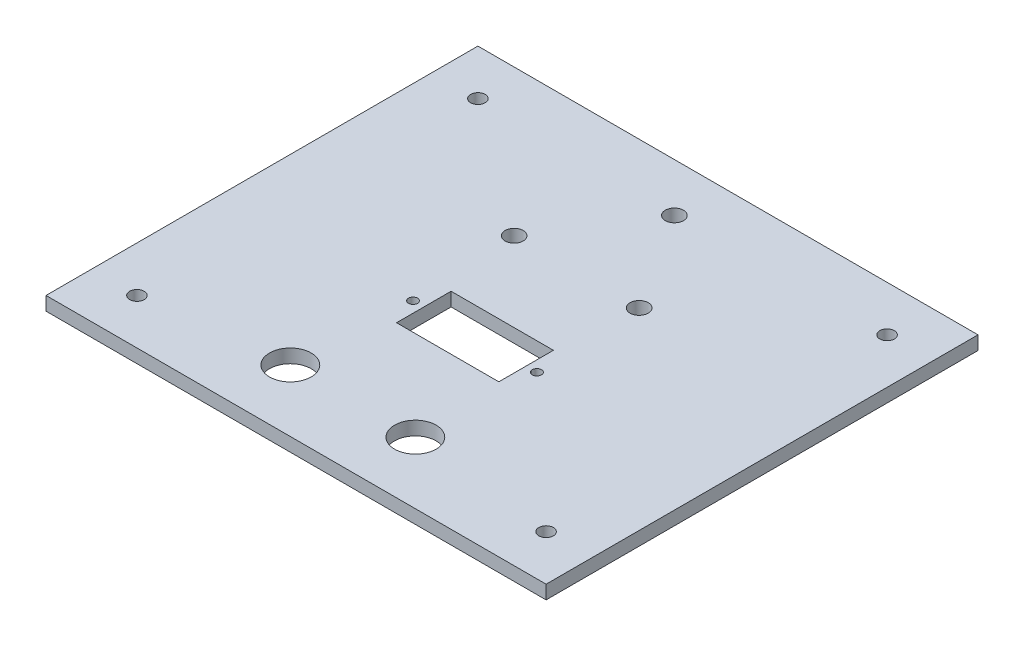
ISO-10303-21;
HEADER;
FILE_DESCRIPTION(('STEP AP214'),'2;1');
FILE_NAME('part.step','',(''),(''),'','','');
FILE_SCHEMA(('AUTOMOTIVE_DESIGN { 1 0 10303 214 1 1 1 1 }'));
ENDSEC;
DATA;
#1=APPLICATION_CONTEXT('core data for automotive mechanical design processes');
#2=APPLICATION_PROTOCOL_DEFINITION('international standard','automotive_design',2000,#1);
#3=PRODUCT_CONTEXT('',#1,'mechanical');
#4=PRODUCT('Part','Part','',(#3));
#5=PRODUCT_RELATED_PRODUCT_CATEGORY('part','',(#4));
#6=PRODUCT_DEFINITION_FORMATION('','',#4);
#7=PRODUCT_DEFINITION_CONTEXT('part definition',#1,'design');
#8=PRODUCT_DEFINITION('design','',#6,#7);
#9=PRODUCT_DEFINITION_SHAPE('','',#8);
#10=(LENGTH_UNIT() NAMED_UNIT(*) SI_UNIT(.MILLI.,.METRE.));
#11=(NAMED_UNIT(*) PLANE_ANGLE_UNIT() SI_UNIT($,.RADIAN.));
#12=(NAMED_UNIT(*) SI_UNIT($,.STERADIAN.) SOLID_ANGLE_UNIT());
#13=UNCERTAINTY_MEASURE_WITH_UNIT(LENGTH_MEASURE(1.E-05),#10,'distance_accuracy_value','');
#14=(GEOMETRIC_REPRESENTATION_CONTEXT(3) GLOBAL_UNCERTAINTY_ASSIGNED_CONTEXT((#13)) GLOBAL_UNIT_ASSIGNED_CONTEXT((#10,
#11,#12)) REPRESENTATION_CONTEXT('',''));
#15=CARTESIAN_POINT('',(0.,0.,0.));
#16=DIRECTION('',(0.,0.,1.));
#17=DIRECTION('',(1.,0.,0.));
#18=AXIS2_PLACEMENT_3D('',#15,#16,#17);
#19=CARTESIAN_POINT('',(0.,3.,47.5));
#20=DIRECTION('',(0.,0.,-1.));
#21=DIRECTION('',(-1.,0.,0.));
#22=AXIS2_PLACEMENT_3D('',#19,#20,#21);
#23=PLANE('',#22);
#24=DIRECTION('',(1.,0.,0.));
#25=VECTOR('',#24,1.);
#26=CARTESIAN_POINT('',(0.,0.,47.5));
#27=LINE('',#26,#25);
#28=CARTESIAN_POINT('',(-55.,0.,47.5));
#29=VERTEX_POINT('',#28);
#30=CARTESIAN_POINT('',(55.,0.,47.5));
#31=VERTEX_POINT('',#30);
#32=EDGE_CURVE('E194',#29,#31,#27,.T.);
#33=ORIENTED_EDGE('',*,*,#32,.T.);
#34=DIRECTION('',(0.,-1.,0.));
#35=VECTOR('',#34,1.);
#36=CARTESIAN_POINT('',(55.,3.,47.5));
#37=LINE('',#36,#35);
#38=CARTESIAN_POINT('',(55.,3.,47.5));
#39=VERTEX_POINT('',#38);
#40=EDGE_CURVE('E260',#39,#31,#37,.T.);
#41=ORIENTED_EDGE('',*,*,#40,.F.);
#42=DIRECTION('',(1.,0.,0.));
#43=VECTOR('',#42,1.);
#44=CARTESIAN_POINT('',(0.,3.,47.5));
#45=LINE('',#44,#43);
#46=CARTESIAN_POINT('',(-55.,3.,47.5));
#47=VERTEX_POINT('',#46);
#48=EDGE_CURVE('E198',#47,#39,#45,.T.);
#49=ORIENTED_EDGE('',*,*,#48,.F.);
#50=DIRECTION('',(0.,-1.,0.));
#51=VECTOR('',#50,1.);
#52=CARTESIAN_POINT('',(-55.,3.,47.5));
#53=LINE('',#52,#51);
#54=EDGE_CURVE('E225',#47,#29,#53,.T.);
#55=ORIENTED_EDGE('',*,*,#54,.T.);
#56=EDGE_LOOP('',(#33,#41,#49,#55));
#57=FACE_BOUND('',#56,.T.);
#58=ADVANCED_FACE('F43',(#57),#23,.F.);
#59=CARTESIAN_POINT('',(55.,3.,0.));
#60=DIRECTION('',(1.,0.,0.));
#61=DIRECTION('',(0.,0.,-1.));
#62=AXIS2_PLACEMENT_3D('',#59,#60,#61);
#63=PLANE('',#62);
#64=DIRECTION('',(0.,0.,1.));
#65=VECTOR('',#64,1.);
#66=CARTESIAN_POINT('',(55.,0.,0.));
#67=LINE('',#66,#65);
#68=CARTESIAN_POINT('',(55.,0.,-47.5));
#69=VERTEX_POINT('',#68);
#70=EDGE_CURVE('E229',#69,#31,#67,.T.);
#71=ORIENTED_EDGE('',*,*,#70,.F.);
#72=DIRECTION('',(0.,-1.,0.));
#73=VECTOR('',#72,1.);
#74=CARTESIAN_POINT('',(55.,3.,-47.5));
#75=LINE('',#74,#73);
#76=CARTESIAN_POINT('',(55.,3.,-47.5));
#77=VERTEX_POINT('',#76);
#78=EDGE_CURVE('E257',#77,#69,#75,.T.);
#79=ORIENTED_EDGE('',*,*,#78,.F.);
#80=DIRECTION('',(0.,0.,1.));
#81=VECTOR('',#80,1.);
#82=CARTESIAN_POINT('',(55.,3.,0.));
#83=LINE('',#82,#81);
#84=EDGE_CURVE('E201',#77,#39,#83,.T.);
#85=ORIENTED_EDGE('',*,*,#84,.T.);
#86=ORIENTED_EDGE('',*,*,#40,.T.);
#87=EDGE_LOOP('',(#71,#79,#85,#86));
#88=FACE_BOUND('',#87,.T.);
#89=ADVANCED_FACE('F294',(#88),#63,.T.);
#90=CARTESIAN_POINT('',(0.,3.,-47.5));
#91=DIRECTION('',(0.,0.,-1.));
#92=DIRECTION('',(-1.,0.,0.));
#93=AXIS2_PLACEMENT_3D('',#90,#91,#92);
#94=PLANE('',#93);
#95=DIRECTION('',(1.,0.,0.));
#96=VECTOR('',#95,1.);
#97=CARTESIAN_POINT('',(0.,0.,-47.5));
#98=LINE('',#97,#96);
#99=CARTESIAN_POINT('',(-55.,0.,-47.5));
#100=VERTEX_POINT('',#99);
#101=EDGE_CURVE('E233',#100,#69,#98,.T.);
#102=ORIENTED_EDGE('',*,*,#101,.F.);
#103=DIRECTION('',(0.,-1.,0.));
#104=VECTOR('',#103,1.);
#105=CARTESIAN_POINT('',(-55.,3.,-47.5));
#106=LINE('',#105,#104);
#107=CARTESIAN_POINT('',(-55.,3.,-47.5));
#108=VERTEX_POINT('',#107);
#109=EDGE_CURVE('E254',#108,#100,#106,.T.);
#110=ORIENTED_EDGE('',*,*,#109,.F.);
#111=DIRECTION('',(1.,0.,0.));
#112=VECTOR('',#111,1.);
#113=CARTESIAN_POINT('',(0.,3.,-47.5));
#114=LINE('',#113,#112);
#115=EDGE_CURVE('E206',#108,#77,#114,.T.);
#116=ORIENTED_EDGE('',*,*,#115,.T.);
#117=ORIENTED_EDGE('',*,*,#78,.T.);
#118=EDGE_LOOP('',(#102,#110,#116,#117));
#119=FACE_BOUND('',#118,.T.);
#120=ADVANCED_FACE('F299',(#119),#94,.T.);
#121=CARTESIAN_POINT('',(-14.8849900476672,3.,-15.3556065702672));
#122=DIRECTION('',(0.,-1.,0.));
#123=DIRECTION('',(0.,0.,-1.));
#124=AXIS2_PLACEMENT_3D('',#121,#122,#123);
#125=CYLINDRICAL_SURFACE('',#124,2.);
#126=CARTESIAN_POINT('',(-14.8849900476672,3.,-15.3556065702672));
#127=DIRECTION('',(0.,1.,0.));
#128=DIRECTION('',(0.,0.,1.));
#129=AXIS2_PLACEMENT_3D('',#126,#127,#128);
#130=CIRCLE('',#129,2.);
#131=CARTESIAN_POINT('',(-14.8849900476672,3.,-13.3556065702671));
#132=VERTEX_POINT('',#131);
#133=EDGE_CURVE('E217',#132,#132,#130,.T.);
#134=ORIENTED_EDGE('',*,*,#133,.T.);
#135=EDGE_LOOP('',(#134));
#136=FACE_BOUND('',#135,.T.);
#137=CARTESIAN_POINT('',(-14.8849900476672,0.,-15.3556065702672));
#138=DIRECTION('',(0.,1.,0.));
#139=DIRECTION('',(0.,0.,1.));
#140=AXIS2_PLACEMENT_3D('',#137,#138,#139);
#141=CIRCLE('',#140,2.);
#142=CARTESIAN_POINT('',(-14.8849900476672,0.,-13.3556065702671));
#143=VERTEX_POINT('',#142);
#144=EDGE_CURVE('E244',#143,#143,#141,.T.);
#145=ORIENTED_EDGE('',*,*,#144,.F.);
#146=EDGE_LOOP('',(#145));
#147=FACE_BOUND('',#146,.T.);
#148=ADVANCED_FACE('F328',(#136,#147),#125,.F.);
#149=CARTESIAN_POINT('',(12.6150099523328,3.,-15.3556065702672));
#150=DIRECTION('',(0.,-1.,0.));
#151=DIRECTION('',(0.,0.,-1.));
#152=AXIS2_PLACEMENT_3D('',#149,#150,#151);
#153=CYLINDRICAL_SURFACE('',#152,2.);
#154=CARTESIAN_POINT('',(12.6150099523328,3.,-15.3556065702672));
#155=DIRECTION('',(0.,1.,0.));
#156=DIRECTION('',(0.,0.,1.));
#157=AXIS2_PLACEMENT_3D('',#154,#155,#156);
#158=CIRCLE('',#157,2.);
#159=CARTESIAN_POINT('',(12.6150099523328,3.,-13.3556065702672));
#160=VERTEX_POINT('',#159);
#161=EDGE_CURVE('E213',#160,#160,#158,.T.);
#162=ORIENTED_EDGE('',*,*,#161,.T.);
#163=EDGE_LOOP('',(#162));
#164=FACE_BOUND('',#163,.T.);
#165=CARTESIAN_POINT('',(12.6150099523328,0.,-15.3556065702672));
#166=DIRECTION('',(0.,1.,0.));
#167=DIRECTION('',(0.,0.,1.));
#168=AXIS2_PLACEMENT_3D('',#165,#166,#167);
#169=CIRCLE('',#168,2.);
#170=CARTESIAN_POINT('',(12.6150099523328,0.,-13.3556065702672));
#171=VERTEX_POINT('',#170);
#172=EDGE_CURVE('E240',#171,#171,#169,.T.);
#173=ORIENTED_EDGE('',*,*,#172,.F.);
#174=EDGE_LOOP('',(#173));
#175=FACE_BOUND('',#174,.T.);
#176=ADVANCED_FACE('F320',(#164,#175),#153,.F.);
#177=CARTESIAN_POINT('',(-55.,3.,0.));
#178=DIRECTION('',(1.,0.,0.));
#179=DIRECTION('',(0.,0.,-1.));
#180=AXIS2_PLACEMENT_3D('',#177,#178,#179);
#181=PLANE('',#180);
#182=DIRECTION('',(0.,0.,1.));
#183=VECTOR('',#182,1.);
#184=CARTESIAN_POINT('',(-55.,0.,0.));
#185=LINE('',#184,#183);
#186=EDGE_CURVE('E237',#100,#29,#185,.T.);
#187=ORIENTED_EDGE('',*,*,#186,.T.);
#188=ORIENTED_EDGE('',*,*,#54,.F.);
#189=DIRECTION('',(0.,0.,1.));
#190=VECTOR('',#189,1.);
#191=CARTESIAN_POINT('',(-55.,3.,0.));
#192=LINE('',#191,#190);
#193=EDGE_CURVE('E210',#108,#47,#192,.T.);
#194=ORIENTED_EDGE('',*,*,#193,.F.);
#195=ORIENTED_EDGE('',*,*,#109,.T.);
#196=EDGE_LOOP('',(#187,#188,#194,#195));
#197=FACE_BOUND('',#196,.T.);
#198=ADVANCED_FACE('F317',(#197),#181,.F.);
#199=CARTESIAN_POINT('',(-1.1349900476672,3.,-36.8556065702671));
#200=DIRECTION('',(0.,-1.,0.));
#201=DIRECTION('',(0.,0.,-1.));
#202=AXIS2_PLACEMENT_3D('',#199,#200,#201);
#203=CYLINDRICAL_SURFACE('',#202,2.);
#204=CARTESIAN_POINT('',(-1.1349900476672,3.,-36.8556065702671));
#205=DIRECTION('',(0.,1.,0.));
#206=DIRECTION('',(0.,0.,1.));
#207=AXIS2_PLACEMENT_3D('',#204,#205,#206);
#208=CIRCLE('',#207,2.);
#209=CARTESIAN_POINT('',(-1.1349900476672,3.,-34.8556065702671));
#210=VERTEX_POINT('',#209);
#211=EDGE_CURVE('E221',#210,#210,#208,.T.);
#212=ORIENTED_EDGE('',*,*,#211,.T.);
#213=EDGE_LOOP('',(#212));
#214=FACE_BOUND('',#213,.T.);
#215=CARTESIAN_POINT('',(-1.1349900476672,0.,-36.8556065702671));
#216=DIRECTION('',(0.,1.,0.));
#217=DIRECTION('',(0.,0.,1.));
#218=AXIS2_PLACEMENT_3D('',#215,#216,#217);
#219=CIRCLE('',#218,2.);
#220=CARTESIAN_POINT('',(-1.1349900476672,0.,-34.8556065702671));
#221=VERTEX_POINT('',#220);
#222=EDGE_CURVE('E202',#221,#221,#219,.T.);
#223=ORIENTED_EDGE('',*,*,#222,.F.);
#224=EDGE_LOOP('',(#223));
#225=FACE_BOUND('',#224,.T.);
#226=ADVANCED_FACE('F319',(#214,#225),#203,.F.);
#227=CARTESIAN_POINT('',(0.,3.,0.));
#228=DIRECTION('',(0.,1.,0.));
#229=DIRECTION('',(0.,0.,1.));
#230=AXIS2_PLACEMENT_3D('',#227,#228,#229);
#231=PLANE('',#230);
#232=CARTESIAN_POINT('',(-13.625,3.,8.14712520640649));
#233=DIRECTION('',(0.,1.,0.));
#234=DIRECTION('',(0.,0.,1.));
#235=AXIS2_PLACEMENT_3D('',#232,#233,#234);
#236=CIRCLE('',#235,1.00000000000006);
#237=CARTESIAN_POINT('',(-13.625,3.,9.14712520640655));
#238=VERTEX_POINT('',#237);
#239=EDGE_CURVE('E140',#238,#238,#236,.T.);
#240=ORIENTED_EDGE('',*,*,#239,.F.);
#241=EDGE_LOOP('',(#240));
#242=FACE_BOUND('',#241,.T.);
#243=DIRECTION('',(1.,0.,0.));
#244=VECTOR('',#243,1.);
#245=CARTESIAN_POINT('',(0.,3.,14.1471252064065));
#246=LINE('',#245,#244);
#247=CARTESIAN_POINT('',(-11.25,3.,14.1471252064065));
#248=VERTEX_POINT('',#247);
#249=CARTESIAN_POINT('',(11.25,3.,14.1471252064065));
#250=VERTEX_POINT('',#249);
#251=EDGE_CURVE('E59',#248,#250,#246,.T.);
#252=ORIENTED_EDGE('',*,*,#251,.F.);
#253=DIRECTION('',(0.,0.,1.));
#254=VECTOR('',#253,1.);
#255=CARTESIAN_POINT('',(-11.25,3.,0.));
#256=LINE('',#255,#254);
#257=CARTESIAN_POINT('',(-11.25,3.,2.14712520640648));
#258=VERTEX_POINT('',#257);
#259=EDGE_CURVE('E130',#258,#248,#256,.T.);
#260=ORIENTED_EDGE('',*,*,#259,.F.);
#261=DIRECTION('',(1.,0.,0.));
#262=VECTOR('',#261,1.);
#263=CARTESIAN_POINT('',(0.,3.,2.14712520640648));
#264=LINE('',#263,#262);
#265=CARTESIAN_POINT('',(11.25,3.,2.14712520640648));
#266=VERTEX_POINT('',#265);
#267=EDGE_CURVE('E112',#258,#266,#264,.T.);
#268=ORIENTED_EDGE('',*,*,#267,.T.);
#269=DIRECTION('',(0.,0.,1.));
#270=VECTOR('',#269,1.);
#271=CARTESIAN_POINT('',(11.25,3.,0.));
#272=LINE('',#271,#270);
#273=EDGE_CURVE('E122',#266,#250,#272,.T.);
#274=ORIENTED_EDGE('',*,*,#273,.T.);
#275=EDGE_LOOP('',(#252,#260,#268,#274));
#276=FACE_BOUND('',#275,.T.);
#277=CARTESIAN_POINT('',(13.625,3.,8.14712520640649));
#278=DIRECTION('',(0.,1.,0.));
#279=DIRECTION('',(0.,0.,1.));
#280=AXIS2_PLACEMENT_3D('',#277,#278,#279);
#281=CIRCLE('',#280,1.00000000000006);
#282=CARTESIAN_POINT('',(13.625,3.,9.14712520640655));
#283=VERTEX_POINT('',#282);
#284=EDGE_CURVE('E145',#283,#283,#281,.T.);
#285=ORIENTED_EDGE('',*,*,#284,.F.);
#286=EDGE_LOOP('',(#285));
#287=FACE_BOUND('',#286,.T.);
#288=CARTESIAN_POINT('',(-14.8849900476672,3.,33.8696909376107));
#289=DIRECTION('',(0.,1.,0.));
#290=DIRECTION('',(0.,0.,1.));
#291=AXIS2_PLACEMENT_3D('',#288,#289,#290);
#292=CIRCLE('',#291,4.575);
#293=CARTESIAN_POINT('',(-14.8849900476672,3.,38.4446909376107));
#294=VERTEX_POINT('',#293);
#295=EDGE_CURVE('E154',#294,#294,#292,.T.);
#296=ORIENTED_EDGE('',*,*,#295,.F.);
#297=EDGE_LOOP('',(#296));
#298=FACE_BOUND('',#297,.T.);
#299=CARTESIAN_POINT('',(12.6150099523328,3.,33.8696909376107));
#300=DIRECTION('',(0.,1.,0.));
#301=DIRECTION('',(0.,0.,1.));
#302=AXIS2_PLACEMENT_3D('',#299,#300,#301);
#303=CIRCLE('',#302,4.57500000000001);
#304=CARTESIAN_POINT('',(12.6150099523328,3.,38.4446909376107));
#305=VERTEX_POINT('',#304);
#306=EDGE_CURVE('E158',#305,#305,#303,.T.);
#307=ORIENTED_EDGE('',*,*,#306,.F.);
#308=EDGE_LOOP('',(#307));
#309=FACE_BOUND('',#308,.T.);
#310=CARTESIAN_POINT('',(45.,3.,-37.5));
#311=DIRECTION('',(0.,1.,0.));
#312=DIRECTION('',(0.,0.,1.));
#313=AXIS2_PLACEMENT_3D('',#310,#311,#312);
#314=CIRCLE('',#313,1.6);
#315=CARTESIAN_POINT('',(45.,3.,-35.9));
#316=VERTEX_POINT('',#315);
#317=EDGE_CURVE('E179',#316,#316,#314,.T.);
#318=ORIENTED_EDGE('',*,*,#317,.F.);
#319=EDGE_LOOP('',(#318));
#320=FACE_BOUND('',#319,.T.);
#321=CARTESIAN_POINT('',(-45.,3.,37.5));
#322=DIRECTION('',(0.,1.,0.));
#323=DIRECTION('',(0.,0.,1.));
#324=AXIS2_PLACEMENT_3D('',#321,#322,#323);
#325=CIRCLE('',#324,1.6);
#326=CARTESIAN_POINT('',(-45.,3.,39.1));
#327=VERTEX_POINT('',#326);
#328=EDGE_CURVE('E170',#327,#327,#325,.T.);
#329=ORIENTED_EDGE('',*,*,#328,.F.);
#330=EDGE_LOOP('',(#329));
#331=FACE_BOUND('',#330,.T.);
#332=CARTESIAN_POINT('',(45.,3.,37.5));
#333=DIRECTION('',(0.,1.,0.));
#334=DIRECTION('',(0.,0.,1.));
#335=AXIS2_PLACEMENT_3D('',#332,#333,#334);
#336=CIRCLE('',#335,1.60000000000001);
#337=CARTESIAN_POINT('',(45.,3.,39.1));
#338=VERTEX_POINT('',#337);
#339=EDGE_CURVE('E153',#338,#338,#336,.T.);
#340=ORIENTED_EDGE('',*,*,#339,.F.);
#341=EDGE_LOOP('',(#340));
#342=FACE_BOUND('',#341,.T.);
#343=CARTESIAN_POINT('',(-45.,3.,-37.5));
#344=DIRECTION('',(0.,1.,0.));
#345=DIRECTION('',(0.,0.,1.));
#346=AXIS2_PLACEMENT_3D('',#343,#344,#345);
#347=CIRCLE('',#346,1.6);
#348=CARTESIAN_POINT('',(-45.,3.,-35.9));
#349=VERTEX_POINT('',#348);
#350=EDGE_CURVE('E178',#349,#349,#347,.T.);
#351=ORIENTED_EDGE('',*,*,#350,.F.);
#352=EDGE_LOOP('',(#351));
#353=FACE_BOUND('',#352,.T.);
#354=ORIENTED_EDGE('',*,*,#48,.T.);
#355=ORIENTED_EDGE('',*,*,#84,.F.);
#356=ORIENTED_EDGE('',*,*,#115,.F.);
#357=ORIENTED_EDGE('',*,*,#193,.T.);
#358=EDGE_LOOP('',(#354,#355,#356,#357));
#359=FACE_BOUND('',#358,.T.);
#360=ORIENTED_EDGE('',*,*,#161,.F.);
#361=EDGE_LOOP('',(#360));
#362=FACE_BOUND('',#361,.T.);
#363=ORIENTED_EDGE('',*,*,#133,.F.);
#364=EDGE_LOOP('',(#363));
#365=FACE_BOUND('',#364,.T.);
#366=ORIENTED_EDGE('',*,*,#211,.F.);
#367=EDGE_LOOP('',(#366));
#368=FACE_BOUND('',#367,.T.);
#369=ADVANCED_FACE('F127',(#242,#276,#287,#298,#309,#320,#331,#342,#353,#359,#362,#365,#368),
#231,.T.);
#370=CARTESIAN_POINT('',(0.,0.,0.));
#371=DIRECTION('',(0.,1.,0.));
#372=DIRECTION('',(0.,0.,1.));
#373=AXIS2_PLACEMENT_3D('',#370,#371,#372);
#374=PLANE('',#373);
#375=CARTESIAN_POINT('',(-13.625,0.,8.14712520640649));
#376=DIRECTION('',(0.,1.,0.));
#377=DIRECTION('',(0.,0.,1.));
#378=AXIS2_PLACEMENT_3D('',#375,#376,#377);
#379=CIRCLE('',#378,1.00000000000006);
#380=CARTESIAN_POINT('',(-13.625,0.,9.14712520640655));
#381=VERTEX_POINT('',#380);
#382=EDGE_CURVE('E46',#381,#381,#379,.T.);
#383=ORIENTED_EDGE('',*,*,#382,.T.);
#384=EDGE_LOOP('',(#383));
#385=FACE_BOUND('',#384,.T.);
#386=DIRECTION('',(0.,0.,1.));
#387=VECTOR('',#386,1.);
#388=CARTESIAN_POINT('',(-11.25,0.,0.));
#389=LINE('',#388,#387);
#390=CARTESIAN_POINT('',(-11.25,0.,2.14712520640648));
#391=VERTEX_POINT('',#390);
#392=CARTESIAN_POINT('',(-11.25,0.,14.1471252064065));
#393=VERTEX_POINT('',#392);
#394=EDGE_CURVE('E52',#391,#393,#389,.T.);
#395=ORIENTED_EDGE('',*,*,#394,.T.);
#396=DIRECTION('',(1.,0.,0.));
#397=VECTOR('',#396,1.);
#398=CARTESIAN_POINT('',(0.,0.,14.1471252064065));
#399=LINE('',#398,#397);
#400=CARTESIAN_POINT('',(11.25,0.,14.1471252064065));
#401=VERTEX_POINT('',#400);
#402=EDGE_CURVE('E11',#393,#401,#399,.T.);
#403=ORIENTED_EDGE('',*,*,#402,.T.);
#404=DIRECTION('',(0.,0.,1.));
#405=VECTOR('',#404,1.);
#406=CARTESIAN_POINT('',(11.25,0.,0.));
#407=LINE('',#406,#405);
#408=CARTESIAN_POINT('',(11.25,0.,2.14712520640648));
#409=VERTEX_POINT('',#408);
#410=EDGE_CURVE('E263',#409,#401,#407,.T.);
#411=ORIENTED_EDGE('',*,*,#410,.F.);
#412=DIRECTION('',(1.,0.,0.));
#413=VECTOR('',#412,1.);
#414=CARTESIAN_POINT('',(0.,0.,2.14712520640648));
#415=LINE('',#414,#413);
#416=EDGE_CURVE('E115',#391,#409,#415,.T.);
#417=ORIENTED_EDGE('',*,*,#416,.F.);
#418=EDGE_LOOP('',(#395,#403,#411,#417));
#419=FACE_BOUND('',#418,.T.);
#420=CARTESIAN_POINT('',(13.625,0.,8.14712520640649));
#421=DIRECTION('',(0.,1.,0.));
#422=DIRECTION('',(0.,0.,1.));
#423=AXIS2_PLACEMENT_3D('',#420,#421,#422);
#424=CIRCLE('',#423,1.00000000000006);
#425=CARTESIAN_POINT('',(13.625,0.,9.14712520640655));
#426=VERTEX_POINT('',#425);
#427=EDGE_CURVE('E264',#426,#426,#424,.T.);
#428=ORIENTED_EDGE('',*,*,#427,.T.);
#429=EDGE_LOOP('',(#428));
#430=FACE_BOUND('',#429,.T.);
#431=CARTESIAN_POINT('',(-14.8849900476672,0.,33.8696909376107));
#432=DIRECTION('',(0.,1.,0.));
#433=DIRECTION('',(0.,0.,1.));
#434=AXIS2_PLACEMENT_3D('',#431,#432,#433);
#435=CIRCLE('',#434,4.575);
#436=CARTESIAN_POINT('',(-14.8849900476672,0.,38.4446909376107));
#437=VERTEX_POINT('',#436);
#438=EDGE_CURVE('E149',#437,#437,#435,.T.);
#439=ORIENTED_EDGE('',*,*,#438,.T.);
#440=EDGE_LOOP('',(#439));
#441=FACE_BOUND('',#440,.T.);
#442=CARTESIAN_POINT('',(12.6150099523328,0.,33.8696909376107));
#443=DIRECTION('',(0.,1.,0.));
#444=DIRECTION('',(0.,0.,1.));
#445=AXIS2_PLACEMENT_3D('',#442,#443,#444);
#446=CIRCLE('',#445,4.57500000000001);
#447=CARTESIAN_POINT('',(12.6150099523328,0.,38.4446909376107));
#448=VERTEX_POINT('',#447);
#449=EDGE_CURVE('E162',#448,#448,#446,.T.);
#450=ORIENTED_EDGE('',*,*,#449,.T.);
#451=EDGE_LOOP('',(#450));
#452=FACE_BOUND('',#451,.T.);
#453=CARTESIAN_POINT('',(45.,0.,-37.5));
#454=DIRECTION('',(0.,1.,0.));
#455=DIRECTION('',(0.,0.,1.));
#456=AXIS2_PLACEMENT_3D('',#453,#454,#455);
#457=CIRCLE('',#456,1.6);
#458=CARTESIAN_POINT('',(45.,0.,-35.9));
#459=VERTEX_POINT('',#458);
#460=EDGE_CURVE('E174',#459,#459,#457,.T.);
#461=ORIENTED_EDGE('',*,*,#460,.T.);
#462=EDGE_LOOP('',(#461));
#463=FACE_BOUND('',#462,.T.);
#464=CARTESIAN_POINT('',(-45.,0.,37.5));
#465=DIRECTION('',(0.,1.,0.));
#466=DIRECTION('',(0.,0.,1.));
#467=AXIS2_PLACEMENT_3D('',#464,#465,#466);
#468=CIRCLE('',#467,1.6);
#469=CARTESIAN_POINT('',(-45.,0.,39.1));
#470=VERTEX_POINT('',#469);
#471=EDGE_CURVE('E183',#470,#470,#468,.T.);
#472=ORIENTED_EDGE('',*,*,#471,.T.);
#473=EDGE_LOOP('',(#472));
#474=FACE_BOUND('',#473,.T.);
#475=CARTESIAN_POINT('',(45.,0.,37.5));
#476=DIRECTION('',(0.,1.,0.));
#477=DIRECTION('',(0.,0.,1.));
#478=AXIS2_PLACEMENT_3D('',#475,#476,#477);
#479=CIRCLE('',#478,1.60000000000001);
#480=CARTESIAN_POINT('',(45.,0.,39.1));
#481=VERTEX_POINT('',#480);
#482=EDGE_CURVE('E166',#481,#481,#479,.T.);
#483=ORIENTED_EDGE('',*,*,#482,.T.);
#484=EDGE_LOOP('',(#483));
#485=FACE_BOUND('',#484,.T.);
#486=CARTESIAN_POINT('',(-45.,0.,-37.5));
#487=DIRECTION('',(0.,1.,0.));
#488=DIRECTION('',(0.,0.,1.));
#489=AXIS2_PLACEMENT_3D('',#486,#487,#488);
#490=CIRCLE('',#489,1.6);
#491=CARTESIAN_POINT('',(-45.,0.,-35.9));
#492=VERTEX_POINT('',#491);
#493=EDGE_CURVE('E190',#492,#492,#490,.T.);
#494=ORIENTED_EDGE('',*,*,#493,.T.);
#495=EDGE_LOOP('',(#494));
#496=FACE_BOUND('',#495,.T.);
#497=ORIENTED_EDGE('',*,*,#32,.F.);
#498=ORIENTED_EDGE('',*,*,#186,.F.);
#499=ORIENTED_EDGE('',*,*,#101,.T.);
#500=ORIENTED_EDGE('',*,*,#70,.T.);
#501=EDGE_LOOP('',(#497,#498,#499,#500));
#502=FACE_BOUND('',#501,.T.);
#503=ORIENTED_EDGE('',*,*,#172,.T.);
#504=EDGE_LOOP('',(#503));
#505=FACE_BOUND('',#504,.T.);
#506=ORIENTED_EDGE('',*,*,#144,.T.);
#507=EDGE_LOOP('',(#506));
#508=FACE_BOUND('',#507,.T.);
#509=ORIENTED_EDGE('',*,*,#222,.T.);
#510=EDGE_LOOP('',(#509));
#511=FACE_BOUND('',#510,.T.);
#512=ADVANCED_FACE('F275',(#385,#419,#430,#441,#452,#463,#474,#485,#496,#502,#505,#508,#511),
#374,.F.);
#513=CARTESIAN_POINT('',(-45.,0.,-37.5));
#514=DIRECTION('',(0.,1.,0.));
#515=DIRECTION('',(0.,0.,1.));
#516=AXIS2_PLACEMENT_3D('',#513,#514,#515);
#517=CYLINDRICAL_SURFACE('',#516,1.6);
#518=ORIENTED_EDGE('',*,*,#493,.F.);
#519=EDGE_LOOP('',(#518));
#520=FACE_BOUND('',#519,.T.);
#521=ORIENTED_EDGE('',*,*,#350,.T.);
#522=EDGE_LOOP('',(#521));
#523=FACE_BOUND('',#522,.T.);
#524=ADVANCED_FACE('F344',(#520,#523),#517,.F.);
#525=CARTESIAN_POINT('',(45.,0.,37.5));
#526=DIRECTION('',(0.,1.,0.));
#527=DIRECTION('',(0.,0.,1.));
#528=AXIS2_PLACEMENT_3D('',#525,#526,#527);
#529=CYLINDRICAL_SURFACE('',#528,1.60000000000001);
#530=ORIENTED_EDGE('',*,*,#482,.F.);
#531=EDGE_LOOP('',(#530));
#532=FACE_BOUND('',#531,.T.);
#533=ORIENTED_EDGE('',*,*,#339,.T.);
#534=EDGE_LOOP('',(#533));
#535=FACE_BOUND('',#534,.T.);
#536=ADVANCED_FACE('F351',(#532,#535),#529,.F.);
#537=CARTESIAN_POINT('',(-45.,0.,37.5));
#538=DIRECTION('',(0.,1.,0.));
#539=DIRECTION('',(0.,0.,1.));
#540=AXIS2_PLACEMENT_3D('',#537,#538,#539);
#541=CYLINDRICAL_SURFACE('',#540,1.6);
#542=ORIENTED_EDGE('',*,*,#471,.F.);
#543=EDGE_LOOP('',(#542));
#544=FACE_BOUND('',#543,.T.);
#545=ORIENTED_EDGE('',*,*,#328,.T.);
#546=EDGE_LOOP('',(#545));
#547=FACE_BOUND('',#546,.T.);
#548=ADVANCED_FACE('F353',(#544,#547),#541,.F.);
#549=CARTESIAN_POINT('',(45.,0.,-37.5));
#550=DIRECTION('',(0.,1.,0.));
#551=DIRECTION('',(0.,0.,1.));
#552=AXIS2_PLACEMENT_3D('',#549,#550,#551);
#553=CYLINDRICAL_SURFACE('',#552,1.6);
#554=ORIENTED_EDGE('',*,*,#460,.F.);
#555=EDGE_LOOP('',(#554));
#556=FACE_BOUND('',#555,.T.);
#557=ORIENTED_EDGE('',*,*,#317,.T.);
#558=EDGE_LOOP('',(#557));
#559=FACE_BOUND('',#558,.T.);
#560=ADVANCED_FACE('F356',(#556,#559),#553,.F.);
#561=CARTESIAN_POINT('',(12.6150099523328,0.,33.8696909376107));
#562=DIRECTION('',(0.,1.,0.));
#563=DIRECTION('',(0.,0.,1.));
#564=AXIS2_PLACEMENT_3D('',#561,#562,#563);
#565=CYLINDRICAL_SURFACE('',#564,4.57500000000001);
#566=ORIENTED_EDGE('',*,*,#449,.F.);
#567=EDGE_LOOP('',(#566));
#568=FACE_BOUND('',#567,.T.);
#569=ORIENTED_EDGE('',*,*,#306,.T.);
#570=EDGE_LOOP('',(#569));
#571=FACE_BOUND('',#570,.T.);
#572=ADVANCED_FACE('F360',(#568,#571),#565,.F.);
#573=CARTESIAN_POINT('',(-14.8849900476672,0.,33.8696909376107));
#574=DIRECTION('',(0.,1.,0.));
#575=DIRECTION('',(0.,0.,1.));
#576=AXIS2_PLACEMENT_3D('',#573,#574,#575);
#577=CYLINDRICAL_SURFACE('',#576,4.575);
#578=ORIENTED_EDGE('',*,*,#438,.F.);
#579=EDGE_LOOP('',(#578));
#580=FACE_BOUND('',#579,.T.);
#581=ORIENTED_EDGE('',*,*,#295,.T.);
#582=EDGE_LOOP('',(#581));
#583=FACE_BOUND('',#582,.T.);
#584=ADVANCED_FACE('F289',(#580,#583),#577,.F.);
#585=CARTESIAN_POINT('',(13.625,-7.,8.14712520640649));
#586=DIRECTION('',(0.,1.,0.));
#587=DIRECTION('',(0.,0.,1.));
#588=AXIS2_PLACEMENT_3D('',#585,#586,#587);
#589=CYLINDRICAL_SURFACE('',#588,1.00000000000006);
#590=ORIENTED_EDGE('',*,*,#284,.T.);
#591=EDGE_LOOP('',(#590));
#592=FACE_BOUND('',#591,.T.);
#593=ORIENTED_EDGE('',*,*,#427,.F.);
#594=EDGE_LOOP('',(#593));
#595=FACE_BOUND('',#594,.T.);
#596=ADVANCED_FACE('F282',(#592,#595),#589,.F.);
#597=CARTESIAN_POINT('',(0.,-7.,14.1471252064065));
#598=DIRECTION('',(0.,0.,1.));
#599=DIRECTION('',(1.,0.,0.));
#600=AXIS2_PLACEMENT_3D('',#597,#598,#599);
#601=PLANE('',#600);
#602=DIRECTION('',(0.,1.,0.));
#603=VECTOR('',#602,1.);
#604=CARTESIAN_POINT('',(-11.25,-7.,14.1471252064065));
#605=LINE('',#604,#603);
#606=EDGE_CURVE('E137',#393,#248,#605,.T.);
#607=ORIENTED_EDGE('',*,*,#606,.T.);
#608=ORIENTED_EDGE('',*,*,#251,.T.);
#609=DIRECTION('',(0.,1.,0.));
#610=VECTOR('',#609,1.);
#611=CARTESIAN_POINT('',(11.25,-7.,14.1471252064065));
#612=LINE('',#611,#610);
#613=EDGE_CURVE('E119',#401,#250,#612,.T.);
#614=ORIENTED_EDGE('',*,*,#613,.F.);
#615=ORIENTED_EDGE('',*,*,#402,.F.);
#616=EDGE_LOOP('',(#607,#608,#614,#615));
#617=FACE_BOUND('',#616,.T.);
#618=ADVANCED_FACE('F280',(#617),#601,.F.);
#619=CARTESIAN_POINT('',(-11.25,-7.,0.));
#620=DIRECTION('',(-1.,0.,0.));
#621=DIRECTION('',(0.,0.,1.));
#622=AXIS2_PLACEMENT_3D('',#619,#620,#621);
#623=PLANE('',#622);
#624=DIRECTION('',(0.,1.,0.));
#625=VECTOR('',#624,1.);
#626=CARTESIAN_POINT('',(-11.25,-7.,2.14712520640648));
#627=LINE('',#626,#625);
#628=EDGE_CURVE('E118',#391,#258,#627,.T.);
#629=ORIENTED_EDGE('',*,*,#628,.T.);
#630=ORIENTED_EDGE('',*,*,#259,.T.);
#631=ORIENTED_EDGE('',*,*,#606,.F.);
#632=ORIENTED_EDGE('',*,*,#394,.F.);
#633=EDGE_LOOP('',(#629,#630,#631,#632));
#634=FACE_BOUND('',#633,.T.);
#635=ADVANCED_FACE('F279',(#634),#623,.F.);
#636=CARTESIAN_POINT('',(0.,-7.,2.14712520640648));
#637=DIRECTION('',(0.,0.,1.));
#638=DIRECTION('',(1.,0.,0.));
#639=AXIS2_PLACEMENT_3D('',#636,#637,#638);
#640=PLANE('',#639);
#641=ORIENTED_EDGE('',*,*,#416,.T.);
#642=DIRECTION('',(0.,1.,0.));
#643=VECTOR('',#642,1.);
#644=CARTESIAN_POINT('',(11.25,-7.,2.14712520640648));
#645=LINE('',#644,#643);
#646=EDGE_CURVE('E67',#409,#266,#645,.T.);
#647=ORIENTED_EDGE('',*,*,#646,.T.);
#648=ORIENTED_EDGE('',*,*,#267,.F.);
#649=ORIENTED_EDGE('',*,*,#628,.F.);
#650=EDGE_LOOP('',(#641,#647,#648,#649));
#651=FACE_BOUND('',#650,.T.);
#652=ADVANCED_FACE('F109',(#651),#640,.T.);
#653=CARTESIAN_POINT('',(11.25,-7.,0.));
#654=DIRECTION('',(-1.,0.,0.));
#655=DIRECTION('',(0.,0.,1.));
#656=AXIS2_PLACEMENT_3D('',#653,#654,#655);
#657=PLANE('',#656);
#658=ORIENTED_EDGE('',*,*,#410,.T.);
#659=ORIENTED_EDGE('',*,*,#613,.T.);
#660=ORIENTED_EDGE('',*,*,#273,.F.);
#661=ORIENTED_EDGE('',*,*,#646,.F.);
#662=EDGE_LOOP('',(#658,#659,#660,#661));
#663=FACE_BOUND('',#662,.T.);
#664=ADVANCED_FACE('F123',(#663),#657,.T.);
#665=CARTESIAN_POINT('',(-13.625,-7.,8.14712520640649));
#666=DIRECTION('',(0.,1.,0.));
#667=DIRECTION('',(0.,0.,1.));
#668=AXIS2_PLACEMENT_3D('',#665,#666,#667);
#669=CYLINDRICAL_SURFACE('',#668,1.00000000000006);
#670=ORIENTED_EDGE('',*,*,#239,.T.);
#671=EDGE_LOOP('',(#670));
#672=FACE_BOUND('',#671,.T.);
#673=ORIENTED_EDGE('',*,*,#382,.F.);
#674=EDGE_LOOP('',(#673));
#675=FACE_BOUND('',#674,.T.);
#676=ADVANCED_FACE('F439',(#672,#675),#669,.F.);
#677=CLOSED_SHELL('',(#58,#89,#120,#148,#176,#198,#226,#369,#512,#524,#536,#548,#560,#572,#584,
#596,#618,#635,#652,#664,#676));
#678=MANIFOLD_SOLID_BREP('B2',#677);
#679=ADVANCED_BREP_SHAPE_REPRESENTATION('',(#18,#678),#14);
#680=SHAPE_DEFINITION_REPRESENTATION(#9,#679);
ENDSEC;
END-ISO-10303-21;
